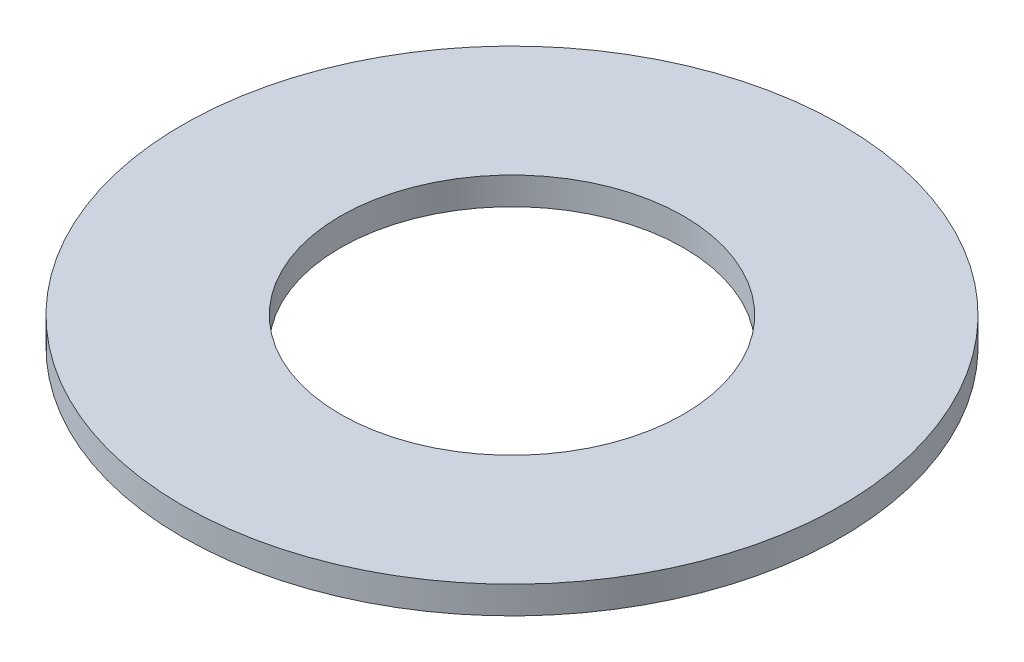
ISO-10303-21;
HEADER;
FILE_DESCRIPTION(('STEP AP214'),'2;1');
FILE_NAME('part.step','',(''),(''),'','','');
FILE_SCHEMA(('AUTOMOTIVE_DESIGN { 1 0 10303 214 1 1 1 1 }'));
ENDSEC;
DATA;
#1=APPLICATION_CONTEXT('core data for automotive mechanical design processes');
#2=APPLICATION_PROTOCOL_DEFINITION('international standard','automotive_design',2000,#1);
#3=PRODUCT_CONTEXT('',#1,'mechanical');
#4=PRODUCT('Part','Part','',(#3));
#5=PRODUCT_RELATED_PRODUCT_CATEGORY('part','',(#4));
#6=PRODUCT_DEFINITION_FORMATION('','',#4);
#7=PRODUCT_DEFINITION_CONTEXT('part definition',#1,'design');
#8=PRODUCT_DEFINITION('design','',#6,#7);
#9=PRODUCT_DEFINITION_SHAPE('','',#8);
#10=(LENGTH_UNIT() NAMED_UNIT(*) SI_UNIT(.MILLI.,.METRE.));
#11=(NAMED_UNIT(*) PLANE_ANGLE_UNIT() SI_UNIT($,.RADIAN.));
#12=(NAMED_UNIT(*) SI_UNIT($,.STERADIAN.) SOLID_ANGLE_UNIT());
#13=UNCERTAINTY_MEASURE_WITH_UNIT(LENGTH_MEASURE(1.E-05),#10,'distance_accuracy_value','');
#14=(GEOMETRIC_REPRESENTATION_CONTEXT(3) GLOBAL_UNCERTAINTY_ASSIGNED_CONTEXT((#13)) GLOBAL_UNIT_ASSIGNED_CONTEXT((#10,
#11,#12)) REPRESENTATION_CONTEXT('',''));
#15=CARTESIAN_POINT('',(0.,0.,0.));
#16=DIRECTION('',(0.,0.,1.));
#17=DIRECTION('',(1.,0.,0.));
#18=AXIS2_PLACEMENT_3D('',#15,#16,#17);
#19=CARTESIAN_POINT('',(0.,-1.,0.));
#20=DIRECTION('',(0.,1.,0.));
#21=DIRECTION('',(0.,0.,1.));
#22=AXIS2_PLACEMENT_3D('',#19,#20,#21);
#23=CYLINDRICAL_SURFACE('',#22,12.);
#24=CARTESIAN_POINT('',(0.,-1.,0.));
#25=DIRECTION('',(0.,1.,0.));
#26=DIRECTION('',(0.,0.,1.));
#27=AXIS2_PLACEMENT_3D('',#24,#25,#26);
#28=CIRCLE('',#27,12.);
#29=CARTESIAN_POINT('',(0.,-1.,12.));
#30=VERTEX_POINT('',#29);
#31=EDGE_CURVE('E10',#30,#30,#28,.T.);
#32=ORIENTED_EDGE('',*,*,#31,.T.);
#33=EDGE_LOOP('',(#32));
#34=FACE_BOUND('',#33,.T.);
#35=CARTESIAN_POINT('',(0.,0.,0.));
#36=DIRECTION('',(0.,1.,0.));
#37=DIRECTION('',(0.,0.,1.));
#38=AXIS2_PLACEMENT_3D('',#35,#36,#37);
#39=CIRCLE('',#38,12.);
#40=CARTESIAN_POINT('',(0.,0.,12.));
#41=VERTEX_POINT('',#40);
#42=EDGE_CURVE('E37',#41,#41,#39,.T.);
#43=ORIENTED_EDGE('',*,*,#42,.F.);
#44=EDGE_LOOP('',(#43));
#45=FACE_BOUND('',#44,.T.);
#46=ADVANCED_FACE('F34',(#34,#45),#23,.T.);
#47=CARTESIAN_POINT('',(0.,-1.,0.));
#48=DIRECTION('',(0.,1.,0.));
#49=DIRECTION('',(0.,0.,1.));
#50=AXIS2_PLACEMENT_3D('',#47,#48,#49);
#51=PLANE('',#50);
#52=CARTESIAN_POINT('',(0.,-1.,0.));
#53=DIRECTION('',(0.,1.,0.));
#54=DIRECTION('',(0.,0.,1.));
#55=AXIS2_PLACEMENT_3D('',#52,#53,#54);
#56=CIRCLE('',#55,6.25);
#57=CARTESIAN_POINT('',(0.,-1.,6.25));
#58=VERTEX_POINT('',#57);
#59=EDGE_CURVE('E44',#58,#58,#56,.T.);
#60=ORIENTED_EDGE('',*,*,#59,.T.);
#61=EDGE_LOOP('',(#60));
#62=FACE_BOUND('',#61,.T.);
#63=ORIENTED_EDGE('',*,*,#31,.F.);
#64=EDGE_LOOP('',(#63));
#65=FACE_BOUND('',#64,.T.);
#66=ADVANCED_FACE('F52',(#62,#65),#51,.F.);
#67=CARTESIAN_POINT('',(0.,0.,0.));
#68=DIRECTION('',(0.,1.,0.));
#69=DIRECTION('',(0.,0.,1.));
#70=AXIS2_PLACEMENT_3D('',#67,#68,#69);
#71=PLANE('',#70);
#72=CARTESIAN_POINT('',(0.,0.,0.));
#73=DIRECTION('',(0.,1.,0.));
#74=DIRECTION('',(0.,0.,1.));
#75=AXIS2_PLACEMENT_3D('',#72,#73,#74);
#76=CIRCLE('',#75,6.25);
#77=CARTESIAN_POINT('',(0.,0.,6.25));
#78=VERTEX_POINT('',#77);
#79=EDGE_CURVE('E46',#78,#78,#76,.T.);
#80=ORIENTED_EDGE('',*,*,#79,.F.);
#81=EDGE_LOOP('',(#80));
#82=FACE_BOUND('',#81,.T.);
#83=ORIENTED_EDGE('',*,*,#42,.T.);
#84=EDGE_LOOP('',(#83));
#85=FACE_BOUND('',#84,.T.);
#86=ADVANCED_FACE('F58',(#82,#85),#71,.T.);
#87=CARTESIAN_POINT('',(0.,-1.,0.));
#88=DIRECTION('',(0.,1.,0.));
#89=DIRECTION('',(0.,0.,1.));
#90=AXIS2_PLACEMENT_3D('',#87,#88,#89);
#91=CYLINDRICAL_SURFACE('',#90,6.25);
#92=ORIENTED_EDGE('',*,*,#59,.F.);
#93=EDGE_LOOP('',(#92));
#94=FACE_BOUND('',#93,.T.);
#95=ORIENTED_EDGE('',*,*,#79,.T.);
#96=EDGE_LOOP('',(#95));
#97=FACE_BOUND('',#96,.T.);
#98=ADVANCED_FACE('F55',(#94,#97),#91,.F.);
#99=CLOSED_SHELL('',(#46,#66,#86,#98));
#100=MANIFOLD_SOLID_BREP('B2',#99);
#101=ADVANCED_BREP_SHAPE_REPRESENTATION('',(#18,#100),#14);
#102=SHAPE_DEFINITION_REPRESENTATION(#9,#101);
ENDSEC;
END-ISO-10303-21;
